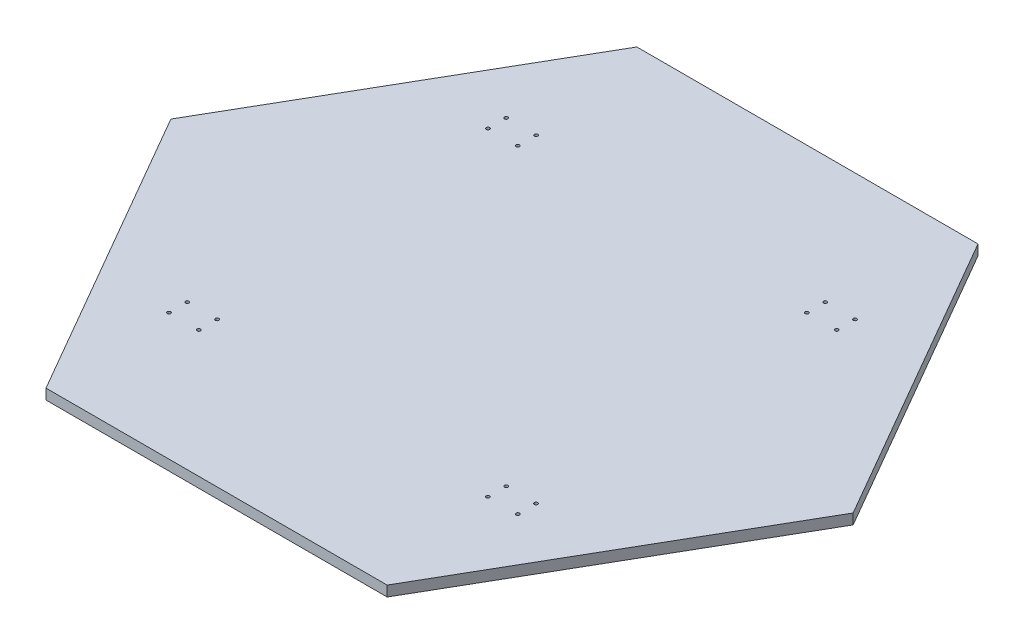
ISO-10303-21;
HEADER;
FILE_DESCRIPTION(('STEP AP214'),'2;1');
FILE_NAME('part.step','',(''),(''),'','','');
FILE_SCHEMA(('AUTOMOTIVE_DESIGN { 1 0 10303 214 1 1 1 1 }'));
ENDSEC;
DATA;
#1=APPLICATION_CONTEXT('core data for automotive mechanical design processes');
#2=APPLICATION_PROTOCOL_DEFINITION('international standard','automotive_design',2000,#1);
#3=PRODUCT_CONTEXT('',#1,'mechanical');
#4=PRODUCT('Part','Part','',(#3));
#5=PRODUCT_RELATED_PRODUCT_CATEGORY('part','',(#4));
#6=PRODUCT_DEFINITION_FORMATION('','',#4);
#7=PRODUCT_DEFINITION_CONTEXT('part definition',#1,'design');
#8=PRODUCT_DEFINITION('design','',#6,#7);
#9=PRODUCT_DEFINITION_SHAPE('','',#8);
#10=(LENGTH_UNIT() NAMED_UNIT(*) SI_UNIT(.MILLI.,.METRE.));
#11=(NAMED_UNIT(*) PLANE_ANGLE_UNIT() SI_UNIT($,.RADIAN.));
#12=(NAMED_UNIT(*) SI_UNIT($,.STERADIAN.) SOLID_ANGLE_UNIT());
#13=UNCERTAINTY_MEASURE_WITH_UNIT(LENGTH_MEASURE(1.E-05),#10,'distance_accuracy_value','');
#14=(GEOMETRIC_REPRESENTATION_CONTEXT(3) GLOBAL_UNCERTAINTY_ASSIGNED_CONTEXT((#13)) GLOBAL_UNIT_ASSIGNED_CONTEXT((#10,
#11,#12)) REPRESENTATION_CONTEXT('',''));
#15=CARTESIAN_POINT('',(0.,0.,0.));
#16=DIRECTION('',(0.,0.,1.));
#17=DIRECTION('',(1.,0.,0.));
#18=AXIS2_PLACEMENT_3D('',#15,#16,#17);
#19=CARTESIAN_POINT('',(417.661742093545,25.4,723.411357683746));
#20=DIRECTION('',(-0.866025403784442,0.,-0.499999999999995));
#21=DIRECTION('',(-0.499999999999995,0.,0.866025403784442));
#22=AXIS2_PLACEMENT_3D('',#19,#20,#21);
#23=PLANE('',#22);
#24=DIRECTION('',(0.499999999999995,0.,-0.866025403784442));
#25=VECTOR('',#24,1.);
#26=CARTESIAN_POINT('',(417.661742093545,0.,723.411357683746));
#27=LINE('',#26,#25);
#28=CARTESIAN_POINT('',(417.661742093545,0.,723.411357683746));
#29=VERTEX_POINT('',#28);
#30=CARTESIAN_POINT('',(835.323484187082,0.,-1.76941794549634E-13));
#31=VERTEX_POINT('',#30);
#32=EDGE_CURVE('E117',#29,#31,#27,.T.);
#33=ORIENTED_EDGE('',*,*,#32,.T.);
#34=DIRECTION('',(0.,-1.,0.));
#35=VECTOR('',#34,1.);
#36=CARTESIAN_POINT('',(835.323484187082,25.4,-1.76941794549634E-13));
#37=LINE('',#36,#35);
#38=CARTESIAN_POINT('',(835.323484187082,25.4,-1.76941794549634E-13));
#39=VERTEX_POINT('',#38);
#40=EDGE_CURVE('E11',#39,#31,#37,.T.);
#41=ORIENTED_EDGE('',*,*,#40,.F.);
#42=DIRECTION('',(0.499999999999995,0.,-0.866025403784442));
#43=VECTOR('',#42,1.);
#44=CARTESIAN_POINT('',(417.661742093545,25.4,723.411357683746));
#45=LINE('',#44,#43);
#46=CARTESIAN_POINT('',(417.661742093545,25.4,723.411357683746));
#47=VERTEX_POINT('',#46);
#48=EDGE_CURVE('E128',#47,#39,#45,.T.);
#49=ORIENTED_EDGE('',*,*,#48,.F.);
#50=DIRECTION('',(0.,-1.,0.));
#51=VECTOR('',#50,1.);
#52=CARTESIAN_POINT('',(417.661742093545,25.4,723.411357683746));
#53=LINE('',#52,#51);
#54=EDGE_CURVE('E113',#47,#29,#53,.T.);
#55=ORIENTED_EDGE('',*,*,#54,.T.);
#56=EDGE_LOOP('',(#33,#41,#49,#55));
#57=FACE_BOUND('',#56,.T.);
#58=ADVANCED_FACE('F33',(#57),#23,.F.);
#59=CARTESIAN_POINT('',(835.323484187082,25.4,-1.76941794549634E-13));
#60=DIRECTION('',(-0.866025403784438,0.,0.500000000000001));
#61=DIRECTION('',(0.500000000000001,0.,0.866025403784438));
#62=AXIS2_PLACEMENT_3D('',#59,#60,#61);
#63=PLANE('',#62);
#64=DIRECTION('',(-0.500000000000001,0.,-0.866025403784438));
#65=VECTOR('',#64,1.);
#66=CARTESIAN_POINT('',(835.323484187082,0.,-1.76941794549634E-13));
#67=LINE('',#66,#65);
#68=CARTESIAN_POINT('',(417.66174209354,0.,-723.411357683743));
#69=VERTEX_POINT('',#68);
#70=EDGE_CURVE('E120',#31,#69,#67,.T.);
#71=ORIENTED_EDGE('',*,*,#70,.T.);
#72=DIRECTION('',(0.,-1.,0.));
#73=VECTOR('',#72,1.);
#74=CARTESIAN_POINT('',(417.66174209354,25.4,-723.411357683743));
#75=LINE('',#74,#73);
#76=CARTESIAN_POINT('',(417.66174209354,25.4,-723.411357683743));
#77=VERTEX_POINT('',#76);
#78=EDGE_CURVE('E41',#77,#69,#75,.T.);
#79=ORIENTED_EDGE('',*,*,#78,.F.);
#80=DIRECTION('',(-0.500000000000001,0.,-0.866025403784438));
#81=VECTOR('',#80,1.);
#82=CARTESIAN_POINT('',(835.323484187082,25.4,-1.76941794549634E-13));
#83=LINE('',#82,#81);
#84=EDGE_CURVE('E86',#39,#77,#83,.T.);
#85=ORIENTED_EDGE('',*,*,#84,.F.);
#86=ORIENTED_EDGE('',*,*,#40,.T.);
#87=EDGE_LOOP('',(#71,#79,#85,#86));
#88=FACE_BOUND('',#87,.T.);
#89=ADVANCED_FACE('F154',(#88),#63,.F.);
#90=CARTESIAN_POINT('',(417.66174209354,25.4,-723.411357683743));
#91=DIRECTION('',(0.,0.,1.));
#92=DIRECTION('',(1.,0.,0.));
#93=AXIS2_PLACEMENT_3D('',#90,#91,#92);
#94=PLANE('',#93);
#95=DIRECTION('',(-1.,0.,0.));
#96=VECTOR('',#95,1.);
#97=CARTESIAN_POINT('',(417.66174209354,0.,-723.411357683743));
#98=LINE('',#97,#96);
#99=CARTESIAN_POINT('',(-417.661742093543,0.,-723.411357683743));
#100=VERTEX_POINT('',#99);
#101=EDGE_CURVE('E123',#69,#100,#98,.T.);
#102=ORIENTED_EDGE('',*,*,#101,.T.);
#103=DIRECTION('',(0.,-1.,0.));
#104=VECTOR('',#103,1.);
#105=CARTESIAN_POINT('',(-417.661742093543,25.4,-723.411357683743));
#106=LINE('',#105,#104);
#107=CARTESIAN_POINT('',(-417.661742093543,25.4,-723.411357683743));
#108=VERTEX_POINT('',#107);
#109=EDGE_CURVE('E108',#108,#100,#106,.T.);
#110=ORIENTED_EDGE('',*,*,#109,.F.);
#111=DIRECTION('',(-1.,0.,0.));
#112=VECTOR('',#111,1.);
#113=CARTESIAN_POINT('',(417.66174209354,25.4,-723.411357683743));
#114=LINE('',#113,#112);
#115=EDGE_CURVE('E99',#77,#108,#114,.T.);
#116=ORIENTED_EDGE('',*,*,#115,.F.);
#117=ORIENTED_EDGE('',*,*,#78,.T.);
#118=EDGE_LOOP('',(#102,#110,#116,#117));
#119=FACE_BOUND('',#118,.T.);
#120=ADVANCED_FACE('F134',(#119),#94,.F.);
#121=CARTESIAN_POINT('',(-417.661742093543,25.4,-723.411357683743));
#122=DIRECTION('',(0.866025403784441,0.,0.499999999999995));
#123=DIRECTION('',(0.499999999999995,0.,-0.866025403784442));
#124=AXIS2_PLACEMENT_3D('',#121,#122,#123);
#125=PLANE('',#124);
#126=DIRECTION('',(-0.499999999999995,0.,0.866025403784442));
#127=VECTOR('',#126,1.);
#128=CARTESIAN_POINT('',(-417.661742093543,0.,-723.411357683743));
#129=LINE('',#128,#127);
#130=CARTESIAN_POINT('',(-835.323484187083,0.,5.87724313660942E-12));
#131=VERTEX_POINT('',#130);
#132=EDGE_CURVE('E107',#100,#131,#129,.T.);
#133=ORIENTED_EDGE('',*,*,#132,.T.);
#134=DIRECTION('',(0.,-1.,0.));
#135=VECTOR('',#134,1.);
#136=CARTESIAN_POINT('',(-835.323484187083,25.4,5.87724313660942E-12));
#137=LINE('',#136,#135);
#138=CARTESIAN_POINT('',(-835.323484187083,25.4,5.87724313660942E-12));
#139=VERTEX_POINT('',#138);
#140=EDGE_CURVE('E104',#139,#131,#137,.T.);
#141=ORIENTED_EDGE('',*,*,#140,.F.);
#142=DIRECTION('',(-0.499999999999995,0.,0.866025403784442));
#143=VECTOR('',#142,1.);
#144=CARTESIAN_POINT('',(-417.661742093543,25.4,-723.411357683743));
#145=LINE('',#144,#143);
#146=EDGE_CURVE('E93',#108,#139,#145,.T.);
#147=ORIENTED_EDGE('',*,*,#146,.F.);
#148=ORIENTED_EDGE('',*,*,#109,.T.);
#149=EDGE_LOOP('',(#133,#141,#147,#148));
#150=FACE_BOUND('',#149,.T.);
#151=ADVANCED_FACE('F105',(#150),#125,.F.);
#152=CARTESIAN_POINT('',(-835.323484187083,25.4,5.87724313660942E-12));
#153=DIRECTION('',(0.866025403784434,0.,-0.500000000000007));
#154=DIRECTION('',(-0.500000000000007,0.,-0.866025403784434));
#155=AXIS2_PLACEMENT_3D('',#152,#153,#154);
#156=PLANE('',#155);
#157=DIRECTION('',(0.500000000000007,0.,0.866025403784434));
#158=VECTOR('',#157,1.);
#159=CARTESIAN_POINT('',(-835.323484187083,0.,5.87724313660942E-12));
#160=LINE('',#159,#158);
#161=CARTESIAN_POINT('',(-417.661742093535,0.,723.411357683746));
#162=VERTEX_POINT('',#161);
#163=EDGE_CURVE('E72',#131,#162,#160,.T.);
#164=ORIENTED_EDGE('',*,*,#163,.T.);
#165=DIRECTION('',(0.,-1.,0.));
#166=VECTOR('',#165,1.);
#167=CARTESIAN_POINT('',(-417.661742093535,25.4,723.411357683746));
#168=LINE('',#167,#166);
#169=CARTESIAN_POINT('',(-417.661742093535,25.4,723.411357683746));
#170=VERTEX_POINT('',#169);
#171=EDGE_CURVE('E109',#170,#162,#168,.T.);
#172=ORIENTED_EDGE('',*,*,#171,.F.);
#173=DIRECTION('',(0.500000000000007,0.,0.866025403784434));
#174=VECTOR('',#173,1.);
#175=CARTESIAN_POINT('',(-835.323484187083,25.4,5.87724313660942E-12));
#176=LINE('',#175,#174);
#177=EDGE_CURVE('E97',#139,#170,#176,.T.);
#178=ORIENTED_EDGE('',*,*,#177,.F.);
#179=ORIENTED_EDGE('',*,*,#140,.T.);
#180=EDGE_LOOP('',(#164,#172,#178,#179));
#181=FACE_BOUND('',#180,.T.);
#182=ADVANCED_FACE('F111',(#181),#156,.F.);
#183=CARTESIAN_POINT('',(-417.661742093535,25.4,723.411357683746));
#184=DIRECTION('',(0.,0.,-1.));
#185=DIRECTION('',(-1.,0.,0.));
#186=AXIS2_PLACEMENT_3D('',#183,#184,#185);
#187=PLANE('',#186);
#188=DIRECTION('',(1.,0.,0.));
#189=VECTOR('',#188,1.);
#190=CARTESIAN_POINT('',(-417.661742093535,0.,723.411357683746));
#191=LINE('',#190,#189);
#192=EDGE_CURVE('E78',#162,#29,#191,.T.);
#193=ORIENTED_EDGE('',*,*,#192,.T.);
#194=ORIENTED_EDGE('',*,*,#54,.F.);
#195=DIRECTION('',(1.,0.,0.));
#196=VECTOR('',#195,1.);
#197=CARTESIAN_POINT('',(-417.661742093535,25.4,723.411357683746));
#198=LINE('',#197,#196);
#199=EDGE_CURVE('E49',#170,#47,#198,.T.);
#200=ORIENTED_EDGE('',*,*,#199,.F.);
#201=ORIENTED_EDGE('',*,*,#171,.T.);
#202=EDGE_LOOP('',(#193,#194,#200,#201));
#203=FACE_BOUND('',#202,.T.);
#204=ADVANCED_FACE('F141',(#203),#187,.F.);
#205=CARTESIAN_POINT('',(0.,25.4,0.));
#206=DIRECTION('',(0.,1.,0.));
#207=DIRECTION('',(0.,0.,1.));
#208=AXIS2_PLACEMENT_3D('',#205,#206,#207);
#209=PLANE('',#208);
#210=CARTESIAN_POINT('',(353.949,25.4,412.877));
#211=DIRECTION('',(0.,1.,0.));
#212=DIRECTION('',(0.,0.,1.));
#213=AXIS2_PLACEMENT_3D('',#210,#211,#212);
#214=CIRCLE('',#213,4.19099999999997);
#215=CARTESIAN_POINT('',(353.949,25.4,417.068));
#216=VERTEX_POINT('',#215);
#217=EDGE_CURVE('E355',#216,#216,#214,.T.);
#218=ORIENTED_EDGE('',*,*,#217,.F.);
#219=EDGE_LOOP('',(#218));
#220=FACE_BOUND('',#219,.T.);
#221=CARTESIAN_POINT('',(353.949,25.4,-412.877));
#222=DIRECTION('',(0.,1.,0.));
#223=DIRECTION('',(0.,0.,-1.));
#224=AXIS2_PLACEMENT_3D('',#221,#222,#223);
#225=CIRCLE('',#224,4.19099999999997);
#226=CARTESIAN_POINT('',(353.949,25.4,-417.068));
#227=VERTEX_POINT('',#226);
#228=EDGE_CURVE('E358',#227,#227,#225,.T.);
#229=ORIENTED_EDGE('',*,*,#228,.F.);
#230=EDGE_LOOP('',(#229));
#231=FACE_BOUND('',#230,.T.);
#232=CARTESIAN_POINT('',(427.101,25.4,-412.877));
#233=DIRECTION('',(0.,1.,0.));
#234=DIRECTION('',(0.,0.,-1.));
#235=AXIS2_PLACEMENT_3D('',#232,#233,#234);
#236=CIRCLE('',#235,4.19099999999997);
#237=CARTESIAN_POINT('',(427.101,25.4,-417.068));
#238=VERTEX_POINT('',#237);
#239=EDGE_CURVE('E464',#238,#238,#236,.T.);
#240=ORIENTED_EDGE('',*,*,#239,.F.);
#241=EDGE_LOOP('',(#240));
#242=FACE_BOUND('',#241,.T.);
#243=CARTESIAN_POINT('',(427.101,25.4,-368.173));
#244=DIRECTION('',(0.,1.,0.));
#245=DIRECTION('',(0.,0.,-1.));
#246=AXIS2_PLACEMENT_3D('',#243,#244,#245);
#247=CIRCLE('',#246,4.19099999999997);
#248=CARTESIAN_POINT('',(427.101,25.4,-372.364));
#249=VERTEX_POINT('',#248);
#250=EDGE_CURVE('E458',#249,#249,#247,.T.);
#251=ORIENTED_EDGE('',*,*,#250,.F.);
#252=EDGE_LOOP('',(#251));
#253=FACE_BOUND('',#252,.T.);
#254=CARTESIAN_POINT('',(353.949,25.4,-368.173));
#255=DIRECTION('',(0.,1.,0.));
#256=DIRECTION('',(0.,0.,-1.));
#257=AXIS2_PLACEMENT_3D('',#254,#255,#256);
#258=CIRCLE('',#257,4.19099999999997);
#259=CARTESIAN_POINT('',(353.949,25.4,-372.364));
#260=VERTEX_POINT('',#259);
#261=EDGE_CURVE('E387',#260,#260,#258,.T.);
#262=ORIENTED_EDGE('',*,*,#261,.F.);
#263=EDGE_LOOP('',(#262));
#264=FACE_BOUND('',#263,.T.);
#265=CARTESIAN_POINT('',(-353.949,25.4,-368.173));
#266=DIRECTION('',(0.,1.,0.));
#267=DIRECTION('',(0.,0.,1.));
#268=AXIS2_PLACEMENT_3D('',#265,#266,#267);
#269=CIRCLE('',#268,4.19099999999997);
#270=CARTESIAN_POINT('',(-353.949,25.4,-363.982));
#271=VERTEX_POINT('',#270);
#272=EDGE_CURVE('E381',#271,#271,#269,.T.);
#273=ORIENTED_EDGE('',*,*,#272,.F.);
#274=EDGE_LOOP('',(#273));
#275=FACE_BOUND('',#274,.T.);
#276=CARTESIAN_POINT('',(-427.101,25.4,-368.173));
#277=DIRECTION('',(0.,1.,0.));
#278=DIRECTION('',(0.,0.,1.));
#279=AXIS2_PLACEMENT_3D('',#276,#277,#278);
#280=CIRCLE('',#279,4.19099999999997);
#281=CARTESIAN_POINT('',(-427.101,25.4,-363.982));
#282=VERTEX_POINT('',#281);
#283=EDGE_CURVE('E375',#282,#282,#280,.T.);
#284=ORIENTED_EDGE('',*,*,#283,.F.);
#285=EDGE_LOOP('',(#284));
#286=FACE_BOUND('',#285,.T.);
#287=CARTESIAN_POINT('',(-427.101,25.4,-412.877));
#288=DIRECTION('',(0.,1.,0.));
#289=DIRECTION('',(0.,0.,1.));
#290=AXIS2_PLACEMENT_3D('',#287,#288,#289);
#291=CIRCLE('',#290,4.19099999999997);
#292=CARTESIAN_POINT('',(-427.101,25.4,-408.686));
#293=VERTEX_POINT('',#292);
#294=EDGE_CURVE('E367',#293,#293,#291,.T.);
#295=ORIENTED_EDGE('',*,*,#294,.F.);
#296=EDGE_LOOP('',(#295));
#297=FACE_BOUND('',#296,.T.);
#298=CARTESIAN_POINT('',(-353.949,25.4,412.877));
#299=DIRECTION('',(0.,1.,0.));
#300=DIRECTION('',(0.,0.,-1.));
#301=AXIS2_PLACEMENT_3D('',#298,#299,#300);
#302=CIRCLE('',#301,4.19099999999997);
#303=CARTESIAN_POINT('',(-353.949,25.4,408.686));
#304=VERTEX_POINT('',#303);
#305=EDGE_CURVE('E493',#304,#304,#302,.T.);
#306=ORIENTED_EDGE('',*,*,#305,.F.);
#307=EDGE_LOOP('',(#306));
#308=FACE_BOUND('',#307,.T.);
#309=CARTESIAN_POINT('',(-427.101,25.4,412.877));
#310=DIRECTION('',(0.,1.,0.));
#311=DIRECTION('',(0.,0.,-1.));
#312=AXIS2_PLACEMENT_3D('',#309,#310,#311);
#313=CIRCLE('',#312,4.19099999999997);
#314=CARTESIAN_POINT('',(-427.101,25.4,408.686));
#315=VERTEX_POINT('',#314);
#316=EDGE_CURVE('E497',#315,#315,#313,.T.);
#317=ORIENTED_EDGE('',*,*,#316,.F.);
#318=EDGE_LOOP('',(#317));
#319=FACE_BOUND('',#318,.T.);
#320=CARTESIAN_POINT('',(-427.101,25.4,368.173));
#321=DIRECTION('',(0.,1.,0.));
#322=DIRECTION('',(0.,0.,-1.));
#323=AXIS2_PLACEMENT_3D('',#320,#321,#322);
#324=CIRCLE('',#323,4.19099999999997);
#325=CARTESIAN_POINT('',(-427.101,25.4,363.982));
#326=VERTEX_POINT('',#325);
#327=EDGE_CURVE('E501',#326,#326,#324,.T.);
#328=ORIENTED_EDGE('',*,*,#327,.F.);
#329=EDGE_LOOP('',(#328));
#330=FACE_BOUND('',#329,.T.);
#331=CARTESIAN_POINT('',(-353.949,25.4,368.173));
#332=DIRECTION('',(0.,1.,0.));
#333=DIRECTION('',(0.,0.,-1.));
#334=AXIS2_PLACEMENT_3D('',#331,#332,#333);
#335=CIRCLE('',#334,4.19099999999997);
#336=CARTESIAN_POINT('',(-353.949,25.4,363.982));
#337=VERTEX_POINT('',#336);
#338=EDGE_CURVE('E454',#337,#337,#335,.T.);
#339=ORIENTED_EDGE('',*,*,#338,.F.);
#340=EDGE_LOOP('',(#339));
#341=FACE_BOUND('',#340,.T.);
#342=CARTESIAN_POINT('',(353.949,25.4,368.173));
#343=DIRECTION('',(0.,1.,0.));
#344=DIRECTION('',(0.,0.,1.));
#345=AXIS2_PLACEMENT_3D('',#342,#343,#344);
#346=CIRCLE('',#345,4.19099999999997);
#347=CARTESIAN_POINT('',(353.949,25.4,372.364));
#348=VERTEX_POINT('',#347);
#349=EDGE_CURVE('E450',#348,#348,#346,.T.);
#350=ORIENTED_EDGE('',*,*,#349,.F.);
#351=EDGE_LOOP('',(#350));
#352=FACE_BOUND('',#351,.T.);
#353=CARTESIAN_POINT('',(427.101,25.4,368.173));
#354=DIRECTION('',(0.,1.,0.));
#355=DIRECTION('',(0.,0.,1.));
#356=AXIS2_PLACEMENT_3D('',#353,#354,#355);
#357=CIRCLE('',#356,4.19099999999997);
#358=CARTESIAN_POINT('',(427.101,25.4,372.364));
#359=VERTEX_POINT('',#358);
#360=EDGE_CURVE('E443',#359,#359,#357,.T.);
#361=ORIENTED_EDGE('',*,*,#360,.F.);
#362=EDGE_LOOP('',(#361));
#363=FACE_BOUND('',#362,.T.);
#364=CARTESIAN_POINT('',(427.101,25.4,412.877));
#365=DIRECTION('',(0.,1.,0.));
#366=DIRECTION('',(0.,0.,1.));
#367=AXIS2_PLACEMENT_3D('',#364,#365,#366);
#368=CIRCLE('',#367,4.19099999999997);
#369=CARTESIAN_POINT('',(427.101,25.4,417.068));
#370=VERTEX_POINT('',#369);
#371=EDGE_CURVE('E361',#370,#370,#368,.T.);
#372=ORIENTED_EDGE('',*,*,#371,.F.);
#373=EDGE_LOOP('',(#372));
#374=FACE_BOUND('',#373,.T.);
#375=CARTESIAN_POINT('',(-353.949,25.4,-412.877));
#376=DIRECTION('',(0.,1.,0.));
#377=DIRECTION('',(0.,0.,1.));
#378=AXIS2_PLACEMENT_3D('',#375,#376,#377);
#379=CIRCLE('',#378,4.19099999999997);
#380=CARTESIAN_POINT('',(-353.949,25.4,-408.686));
#381=VERTEX_POINT('',#380);
#382=EDGE_CURVE('E374',#381,#381,#379,.T.);
#383=ORIENTED_EDGE('',*,*,#382,.F.);
#384=EDGE_LOOP('',(#383));
#385=FACE_BOUND('',#384,.T.);
#386=ORIENTED_EDGE('',*,*,#48,.T.);
#387=ORIENTED_EDGE('',*,*,#84,.T.);
#388=ORIENTED_EDGE('',*,*,#115,.T.);
#389=ORIENTED_EDGE('',*,*,#146,.T.);
#390=ORIENTED_EDGE('',*,*,#177,.T.);
#391=ORIENTED_EDGE('',*,*,#199,.T.);
#392=EDGE_LOOP('',(#386,#387,#388,#389,#390,#391));
#393=FACE_BOUND('',#392,.T.);
#394=ADVANCED_FACE('F95',(#220,#231,#242,#253,#264,#275,#286,#297,#308,#319,#330,#341,#352,#363,
#374,#385,#393),#209,.T.);
#395=CARTESIAN_POINT('',(0.,0.,0.));
#396=DIRECTION('',(0.,1.,0.));
#397=DIRECTION('',(0.,0.,1.));
#398=AXIS2_PLACEMENT_3D('',#395,#396,#397);
#399=PLANE('',#398);
#400=CARTESIAN_POINT('',(353.949,0.,412.877));
#401=DIRECTION('',(0.,1.,0.));
#402=DIRECTION('',(0.,0.,1.));
#403=AXIS2_PLACEMENT_3D('',#400,#401,#402);
#404=CIRCLE('',#403,4.19099999999997);
#405=CARTESIAN_POINT('',(353.949,0.,417.068));
#406=VERTEX_POINT('',#405);
#407=EDGE_CURVE('E352',#406,#406,#404,.F.);
#408=ORIENTED_EDGE('',*,*,#407,.F.);
#409=EDGE_LOOP('',(#408));
#410=FACE_BOUND('',#409,.T.);
#411=CARTESIAN_POINT('',(353.949,0.,-412.877));
#412=DIRECTION('',(0.,1.,0.));
#413=DIRECTION('',(0.,0.,1.));
#414=AXIS2_PLACEMENT_3D('',#411,#412,#413);
#415=CIRCLE('',#414,4.19099999999997);
#416=CARTESIAN_POINT('',(353.949,0.,-408.686));
#417=VERTEX_POINT('',#416);
#418=EDGE_CURVE('E364',#417,#417,#415,.F.);
#419=ORIENTED_EDGE('',*,*,#418,.F.);
#420=EDGE_LOOP('',(#419));
#421=FACE_BOUND('',#420,.T.);
#422=CARTESIAN_POINT('',(427.101,0.,-412.877));
#423=DIRECTION('',(0.,1.,0.));
#424=DIRECTION('',(0.,0.,1.));
#425=AXIS2_PLACEMENT_3D('',#422,#423,#424);
#426=CIRCLE('',#425,4.19099999999997);
#427=CARTESIAN_POINT('',(427.101,0.,-408.686));
#428=VERTEX_POINT('',#427);
#429=EDGE_CURVE('E461',#428,#428,#426,.F.);
#430=ORIENTED_EDGE('',*,*,#429,.F.);
#431=EDGE_LOOP('',(#430));
#432=FACE_BOUND('',#431,.T.);
#433=CARTESIAN_POINT('',(427.101,0.,-368.173));
#434=DIRECTION('',(0.,1.,0.));
#435=DIRECTION('',(0.,0.,1.));
#436=AXIS2_PLACEMENT_3D('',#433,#434,#435);
#437=CIRCLE('',#436,4.19099999999997);
#438=CARTESIAN_POINT('',(427.101,0.,-363.982));
#439=VERTEX_POINT('',#438);
#440=EDGE_CURVE('E390',#439,#439,#437,.F.);
#441=ORIENTED_EDGE('',*,*,#440,.F.);
#442=EDGE_LOOP('',(#441));
#443=FACE_BOUND('',#442,.T.);
#444=CARTESIAN_POINT('',(353.949,0.,-368.173));
#445=DIRECTION('',(0.,1.,0.));
#446=DIRECTION('',(0.,0.,1.));
#447=AXIS2_PLACEMENT_3D('',#444,#445,#446);
#448=CIRCLE('',#447,4.19099999999997);
#449=CARTESIAN_POINT('',(353.949,0.,-363.982));
#450=VERTEX_POINT('',#449);
#451=EDGE_CURVE('E384',#450,#450,#448,.F.);
#452=ORIENTED_EDGE('',*,*,#451,.F.);
#453=EDGE_LOOP('',(#452));
#454=FACE_BOUND('',#453,.T.);
#455=CARTESIAN_POINT('',(-353.949,0.,-368.173));
#456=DIRECTION('',(0.,1.,0.));
#457=DIRECTION('',(0.,0.,1.));
#458=AXIS2_PLACEMENT_3D('',#455,#456,#457);
#459=CIRCLE('',#458,4.19099999999997);
#460=CARTESIAN_POINT('',(-353.949,0.,-363.982));
#461=VERTEX_POINT('',#460);
#462=EDGE_CURVE('E378',#461,#461,#459,.F.);
#463=ORIENTED_EDGE('',*,*,#462,.F.);
#464=EDGE_LOOP('',(#463));
#465=FACE_BOUND('',#464,.T.);
#466=CARTESIAN_POINT('',(-427.101,0.,-368.173));
#467=DIRECTION('',(0.,1.,0.));
#468=DIRECTION('',(0.,0.,1.));
#469=AXIS2_PLACEMENT_3D('',#466,#467,#468);
#470=CIRCLE('',#469,4.19099999999997);
#471=CARTESIAN_POINT('',(-427.101,0.,-363.982));
#472=VERTEX_POINT('',#471);
#473=EDGE_CURVE('E371',#472,#472,#470,.F.);
#474=ORIENTED_EDGE('',*,*,#473,.F.);
#475=EDGE_LOOP('',(#474));
#476=FACE_BOUND('',#475,.T.);
#477=CARTESIAN_POINT('',(-427.101,0.,-412.877));
#478=DIRECTION('',(0.,1.,0.));
#479=DIRECTION('',(0.,0.,1.));
#480=AXIS2_PLACEMENT_3D('',#477,#478,#479);
#481=CIRCLE('',#480,4.19099999999997);
#482=CARTESIAN_POINT('',(-427.101,0.,-408.686));
#483=VERTEX_POINT('',#482);
#484=EDGE_CURVE('E370',#483,#483,#481,.F.);
#485=ORIENTED_EDGE('',*,*,#484,.F.);
#486=EDGE_LOOP('',(#485));
#487=FACE_BOUND('',#486,.T.);
#488=CARTESIAN_POINT('',(-353.949,0.,412.877));
#489=DIRECTION('',(0.,1.,0.));
#490=DIRECTION('',(0.,0.,1.));
#491=AXIS2_PLACEMENT_3D('',#488,#489,#490);
#492=CIRCLE('',#491,4.19099999999997);
#493=CARTESIAN_POINT('',(-353.949,0.,417.068));
#494=VERTEX_POINT('',#493);
#495=EDGE_CURVE('E416',#494,#494,#492,.F.);
#496=ORIENTED_EDGE('',*,*,#495,.F.);
#497=EDGE_LOOP('',(#496));
#498=FACE_BOUND('',#497,.T.);
#499=CARTESIAN_POINT('',(-427.101,0.,412.877));
#500=DIRECTION('',(0.,1.,0.));
#501=DIRECTION('',(0.,0.,1.));
#502=AXIS2_PLACEMENT_3D('',#499,#500,#501);
#503=CIRCLE('',#502,4.19099999999997);
#504=CARTESIAN_POINT('',(-427.101,0.,417.068));
#505=VERTEX_POINT('',#504);
#506=EDGE_CURVE('E420',#505,#505,#503,.F.);
#507=ORIENTED_EDGE('',*,*,#506,.F.);
#508=EDGE_LOOP('',(#507));
#509=FACE_BOUND('',#508,.T.);
#510=CARTESIAN_POINT('',(-427.101,0.,368.173));
#511=DIRECTION('',(0.,1.,0.));
#512=DIRECTION('',(0.,0.,1.));
#513=AXIS2_PLACEMENT_3D('',#510,#511,#512);
#514=CIRCLE('',#513,4.19099999999997);
#515=CARTESIAN_POINT('',(-427.101,0.,372.364));
#516=VERTEX_POINT('',#515);
#517=EDGE_CURVE('E424',#516,#516,#514,.F.);
#518=ORIENTED_EDGE('',*,*,#517,.F.);
#519=EDGE_LOOP('',(#518));
#520=FACE_BOUND('',#519,.T.);
#521=CARTESIAN_POINT('',(-353.949,0.,368.173));
#522=DIRECTION('',(0.,1.,0.));
#523=DIRECTION('',(0.,0.,1.));
#524=AXIS2_PLACEMENT_3D('',#521,#522,#523);
#525=CIRCLE('',#524,4.19099999999997);
#526=CARTESIAN_POINT('',(-353.949,0.,372.364));
#527=VERTEX_POINT('',#526);
#528=EDGE_CURVE('E428',#527,#527,#525,.F.);
#529=ORIENTED_EDGE('',*,*,#528,.F.);
#530=EDGE_LOOP('',(#529));
#531=FACE_BOUND('',#530,.T.);
#532=CARTESIAN_POINT('',(353.949,0.,368.173));
#533=DIRECTION('',(0.,1.,0.));
#534=DIRECTION('',(0.,0.,1.));
#535=AXIS2_PLACEMENT_3D('',#532,#533,#534);
#536=CIRCLE('',#535,4.19099999999997);
#537=CARTESIAN_POINT('',(353.949,0.,372.364));
#538=VERTEX_POINT('',#537);
#539=EDGE_CURVE('E432',#538,#538,#536,.F.);
#540=ORIENTED_EDGE('',*,*,#539,.F.);
#541=EDGE_LOOP('',(#540));
#542=FACE_BOUND('',#541,.T.);
#543=CARTESIAN_POINT('',(427.101,0.,368.173));
#544=DIRECTION('',(0.,1.,0.));
#545=DIRECTION('',(0.,0.,1.));
#546=AXIS2_PLACEMENT_3D('',#543,#544,#545);
#547=CIRCLE('',#546,4.19099999999997);
#548=CARTESIAN_POINT('',(427.101,0.,372.364));
#549=VERTEX_POINT('',#548);
#550=EDGE_CURVE('E436',#549,#549,#547,.F.);
#551=ORIENTED_EDGE('',*,*,#550,.F.);
#552=EDGE_LOOP('',(#551));
#553=FACE_BOUND('',#552,.T.);
#554=CARTESIAN_POINT('',(427.101,0.,412.877));
#555=DIRECTION('',(0.,1.,0.));
#556=DIRECTION('',(0.,0.,1.));
#557=AXIS2_PLACEMENT_3D('',#554,#555,#556);
#558=CIRCLE('',#557,4.19099999999997);
#559=CARTESIAN_POINT('',(427.101,0.,417.068));
#560=VERTEX_POINT('',#559);
#561=EDGE_CURVE('E356',#560,#560,#558,.F.);
#562=ORIENTED_EDGE('',*,*,#561,.F.);
#563=EDGE_LOOP('',(#562));
#564=FACE_BOUND('',#563,.T.);
#565=CARTESIAN_POINT('',(-353.949,0.,-412.877));
#566=DIRECTION('',(0.,1.,0.));
#567=DIRECTION('',(0.,0.,1.));
#568=AXIS2_PLACEMENT_3D('',#565,#566,#567);
#569=CIRCLE('',#568,4.19099999999997);
#570=CARTESIAN_POINT('',(-353.949,0.,-408.686));
#571=VERTEX_POINT('',#570);
#572=EDGE_CURVE('E121',#571,#571,#569,.F.);
#573=ORIENTED_EDGE('',*,*,#572,.F.);
#574=EDGE_LOOP('',(#573));
#575=FACE_BOUND('',#574,.T.);
#576=ORIENTED_EDGE('',*,*,#32,.F.);
#577=ORIENTED_EDGE('',*,*,#192,.F.);
#578=ORIENTED_EDGE('',*,*,#163,.F.);
#579=ORIENTED_EDGE('',*,*,#132,.F.);
#580=ORIENTED_EDGE('',*,*,#101,.F.);
#581=ORIENTED_EDGE('',*,*,#70,.F.);
#582=EDGE_LOOP('',(#576,#577,#578,#579,#580,#581));
#583=FACE_BOUND('',#582,.T.);
#584=ADVANCED_FACE('F137',(#410,#421,#432,#443,#454,#465,#476,#487,#498,#509,#520,#531,#542,
#553,#564,#575,#583),#399,.F.);
#585=CARTESIAN_POINT('',(-353.949,-11.8539380798111,-412.877));
#586=DIRECTION('',(0.,1.,0.));
#587=DIRECTION('',(0.,0.,1.));
#588=AXIS2_PLACEMENT_3D('',#585,#586,#587);
#589=CYLINDRICAL_SURFACE('',#588,4.19099999999997);
#590=ORIENTED_EDGE('',*,*,#572,.T.);
#591=EDGE_LOOP('',(#590));
#592=FACE_BOUND('',#591,.T.);
#593=ORIENTED_EDGE('',*,*,#382,.T.);
#594=EDGE_LOOP('',(#593));
#595=FACE_BOUND('',#594,.T.);
#596=ADVANCED_FACE('F187',(#592,#595),#589,.F.);
#597=CARTESIAN_POINT('',(427.101,-11.8539380798111,412.877));
#598=DIRECTION('',(0.,1.,0.));
#599=DIRECTION('',(0.,0.,1.));
#600=AXIS2_PLACEMENT_3D('',#597,#598,#599);
#601=CYLINDRICAL_SURFACE('',#600,4.19099999999997);
#602=ORIENTED_EDGE('',*,*,#561,.T.);
#603=EDGE_LOOP('',(#602));
#604=FACE_BOUND('',#603,.T.);
#605=ORIENTED_EDGE('',*,*,#371,.T.);
#606=EDGE_LOOP('',(#605));
#607=FACE_BOUND('',#606,.T.);
#608=ADVANCED_FACE('F195',(#604,#607),#601,.F.);
#609=CARTESIAN_POINT('',(427.101,-11.8539380798111,368.173));
#610=DIRECTION('',(0.,1.,0.));
#611=DIRECTION('',(0.,0.,1.));
#612=AXIS2_PLACEMENT_3D('',#609,#610,#611);
#613=CYLINDRICAL_SURFACE('',#612,4.19099999999997);
#614=ORIENTED_EDGE('',*,*,#550,.T.);
#615=EDGE_LOOP('',(#614));
#616=FACE_BOUND('',#615,.T.);
#617=ORIENTED_EDGE('',*,*,#360,.T.);
#618=EDGE_LOOP('',(#617));
#619=FACE_BOUND('',#618,.T.);
#620=ADVANCED_FACE('F205',(#616,#619),#613,.F.);
#621=CARTESIAN_POINT('',(353.949,-11.8539380798111,368.173));
#622=DIRECTION('',(0.,1.,0.));
#623=DIRECTION('',(0.,0.,1.));
#624=AXIS2_PLACEMENT_3D('',#621,#622,#623);
#625=CYLINDRICAL_SURFACE('',#624,4.19099999999997);
#626=ORIENTED_EDGE('',*,*,#539,.T.);
#627=EDGE_LOOP('',(#626));
#628=FACE_BOUND('',#627,.T.);
#629=ORIENTED_EDGE('',*,*,#349,.T.);
#630=EDGE_LOOP('',(#629));
#631=FACE_BOUND('',#630,.T.);
#632=ADVANCED_FACE('F215',(#628,#631),#625,.F.);
#633=CARTESIAN_POINT('',(-353.949,-11.8539380798111,368.173));
#634=DIRECTION('',(0.,1.,0.));
#635=DIRECTION('',(0.,0.,1.));
#636=AXIS2_PLACEMENT_3D('',#633,#634,#635);
#637=CYLINDRICAL_SURFACE('',#636,4.19099999999997);
#638=ORIENTED_EDGE('',*,*,#528,.T.);
#639=EDGE_LOOP('',(#638));
#640=FACE_BOUND('',#639,.T.);
#641=ORIENTED_EDGE('',*,*,#338,.T.);
#642=EDGE_LOOP('',(#641));
#643=FACE_BOUND('',#642,.T.);
#644=ADVANCED_FACE('F225',(#640,#643),#637,.F.);
#645=CARTESIAN_POINT('',(-427.101,-11.8539380798111,368.173));
#646=DIRECTION('',(0.,1.,0.));
#647=DIRECTION('',(0.,0.,1.));
#648=AXIS2_PLACEMENT_3D('',#645,#646,#647);
#649=CYLINDRICAL_SURFACE('',#648,4.19099999999997);
#650=ORIENTED_EDGE('',*,*,#517,.T.);
#651=EDGE_LOOP('',(#650));
#652=FACE_BOUND('',#651,.T.);
#653=ORIENTED_EDGE('',*,*,#327,.T.);
#654=EDGE_LOOP('',(#653));
#655=FACE_BOUND('',#654,.T.);
#656=ADVANCED_FACE('F235',(#652,#655),#649,.F.);
#657=CARTESIAN_POINT('',(-427.101,-11.8539380798111,412.877));
#658=DIRECTION('',(0.,1.,0.));
#659=DIRECTION('',(0.,0.,1.));
#660=AXIS2_PLACEMENT_3D('',#657,#658,#659);
#661=CYLINDRICAL_SURFACE('',#660,4.19099999999997);
#662=ORIENTED_EDGE('',*,*,#506,.T.);
#663=EDGE_LOOP('',(#662));
#664=FACE_BOUND('',#663,.T.);
#665=ORIENTED_EDGE('',*,*,#316,.T.);
#666=EDGE_LOOP('',(#665));
#667=FACE_BOUND('',#666,.T.);
#668=ADVANCED_FACE('F245',(#664,#667),#661,.F.);
#669=CARTESIAN_POINT('',(-353.949,-11.8539380798111,412.877));
#670=DIRECTION('',(0.,1.,0.));
#671=DIRECTION('',(0.,0.,1.));
#672=AXIS2_PLACEMENT_3D('',#669,#670,#671);
#673=CYLINDRICAL_SURFACE('',#672,4.19099999999997);
#674=ORIENTED_EDGE('',*,*,#495,.T.);
#675=EDGE_LOOP('',(#674));
#676=FACE_BOUND('',#675,.T.);
#677=ORIENTED_EDGE('',*,*,#305,.T.);
#678=EDGE_LOOP('',(#677));
#679=FACE_BOUND('',#678,.T.);
#680=ADVANCED_FACE('F255',(#676,#679),#673,.F.);
#681=CARTESIAN_POINT('',(-427.101,-11.8539380798111,-412.877));
#682=DIRECTION('',(0.,1.,0.));
#683=DIRECTION('',(0.,0.,1.));
#684=AXIS2_PLACEMENT_3D('',#681,#682,#683);
#685=CYLINDRICAL_SURFACE('',#684,4.19099999999997);
#686=ORIENTED_EDGE('',*,*,#484,.T.);
#687=EDGE_LOOP('',(#686));
#688=FACE_BOUND('',#687,.T.);
#689=ORIENTED_EDGE('',*,*,#294,.T.);
#690=EDGE_LOOP('',(#689));
#691=FACE_BOUND('',#690,.T.);
#692=ADVANCED_FACE('F265',(#688,#691),#685,.F.);
#693=CARTESIAN_POINT('',(-427.101,-11.8539380798111,-368.173));
#694=DIRECTION('',(0.,1.,0.));
#695=DIRECTION('',(0.,0.,1.));
#696=AXIS2_PLACEMENT_3D('',#693,#694,#695);
#697=CYLINDRICAL_SURFACE('',#696,4.19099999999997);
#698=ORIENTED_EDGE('',*,*,#473,.T.);
#699=EDGE_LOOP('',(#698));
#700=FACE_BOUND('',#699,.T.);
#701=ORIENTED_EDGE('',*,*,#283,.T.);
#702=EDGE_LOOP('',(#701));
#703=FACE_BOUND('',#702,.T.);
#704=ADVANCED_FACE('F275',(#700,#703),#697,.F.);
#705=CARTESIAN_POINT('',(-353.949,-11.8539380798111,-368.173));
#706=DIRECTION('',(0.,1.,0.));
#707=DIRECTION('',(0.,0.,1.));
#708=AXIS2_PLACEMENT_3D('',#705,#706,#707);
#709=CYLINDRICAL_SURFACE('',#708,4.19099999999997);
#710=ORIENTED_EDGE('',*,*,#462,.T.);
#711=EDGE_LOOP('',(#710));
#712=FACE_BOUND('',#711,.T.);
#713=ORIENTED_EDGE('',*,*,#272,.T.);
#714=EDGE_LOOP('',(#713));
#715=FACE_BOUND('',#714,.T.);
#716=ADVANCED_FACE('F285',(#712,#715),#709,.F.);
#717=CARTESIAN_POINT('',(353.949,-11.8539380798111,-368.173));
#718=DIRECTION('',(0.,1.,0.));
#719=DIRECTION('',(0.,0.,1.));
#720=AXIS2_PLACEMENT_3D('',#717,#718,#719);
#721=CYLINDRICAL_SURFACE('',#720,4.19099999999997);
#722=ORIENTED_EDGE('',*,*,#451,.T.);
#723=EDGE_LOOP('',(#722));
#724=FACE_BOUND('',#723,.T.);
#725=ORIENTED_EDGE('',*,*,#261,.T.);
#726=EDGE_LOOP('',(#725));
#727=FACE_BOUND('',#726,.T.);
#728=ADVANCED_FACE('F295',(#724,#727),#721,.F.);
#729=CARTESIAN_POINT('',(427.101,-11.8539380798111,-368.173));
#730=DIRECTION('',(0.,1.,0.));
#731=DIRECTION('',(0.,0.,1.));
#732=AXIS2_PLACEMENT_3D('',#729,#730,#731);
#733=CYLINDRICAL_SURFACE('',#732,4.19099999999997);
#734=ORIENTED_EDGE('',*,*,#440,.T.);
#735=EDGE_LOOP('',(#734));
#736=FACE_BOUND('',#735,.T.);
#737=ORIENTED_EDGE('',*,*,#250,.T.);
#738=EDGE_LOOP('',(#737));
#739=FACE_BOUND('',#738,.T.);
#740=ADVANCED_FACE('F305',(#736,#739),#733,.F.);
#741=CARTESIAN_POINT('',(427.101,-11.8539380798111,-412.877));
#742=DIRECTION('',(0.,1.,0.));
#743=DIRECTION('',(0.,0.,1.));
#744=AXIS2_PLACEMENT_3D('',#741,#742,#743);
#745=CYLINDRICAL_SURFACE('',#744,4.19099999999997);
#746=ORIENTED_EDGE('',*,*,#429,.T.);
#747=EDGE_LOOP('',(#746));
#748=FACE_BOUND('',#747,.T.);
#749=ORIENTED_EDGE('',*,*,#239,.T.);
#750=EDGE_LOOP('',(#749));
#751=FACE_BOUND('',#750,.T.);
#752=ADVANCED_FACE('F315',(#748,#751),#745,.F.);
#753=CARTESIAN_POINT('',(353.949,-11.8539380798111,-412.877));
#754=DIRECTION('',(0.,1.,0.));
#755=DIRECTION('',(0.,0.,1.));
#756=AXIS2_PLACEMENT_3D('',#753,#754,#755);
#757=CYLINDRICAL_SURFACE('',#756,4.19099999999997);
#758=ORIENTED_EDGE('',*,*,#418,.T.);
#759=EDGE_LOOP('',(#758));
#760=FACE_BOUND('',#759,.T.);
#761=ORIENTED_EDGE('',*,*,#228,.T.);
#762=EDGE_LOOP('',(#761));
#763=FACE_BOUND('',#762,.T.);
#764=ADVANCED_FACE('F325',(#760,#763),#757,.F.);
#765=CARTESIAN_POINT('',(353.949,-11.8539380798111,412.877));
#766=DIRECTION('',(0.,1.,0.));
#767=DIRECTION('',(0.,0.,1.));
#768=AXIS2_PLACEMENT_3D('',#765,#766,#767);
#769=CYLINDRICAL_SURFACE('',#768,4.19099999999997);
#770=ORIENTED_EDGE('',*,*,#407,.T.);
#771=EDGE_LOOP('',(#770));
#772=FACE_BOUND('',#771,.T.);
#773=ORIENTED_EDGE('',*,*,#217,.T.);
#774=EDGE_LOOP('',(#773));
#775=FACE_BOUND('',#774,.T.);
#776=ADVANCED_FACE('F335',(#772,#775),#769,.F.);
#777=CLOSED_SHELL('',(#58,#89,#120,#151,#182,#204,#394,#584,#596,#608,#620,#632,#644,#656,#668,
#680,#692,#704,#716,#728,#740,#752,#764,#776));
#778=MANIFOLD_SOLID_BREP('B2',#777);
#779=ADVANCED_BREP_SHAPE_REPRESENTATION('',(#18,#778),#14);
#780=SHAPE_DEFINITION_REPRESENTATION(#9,#779);
ENDSEC;
END-ISO-10303-21;
